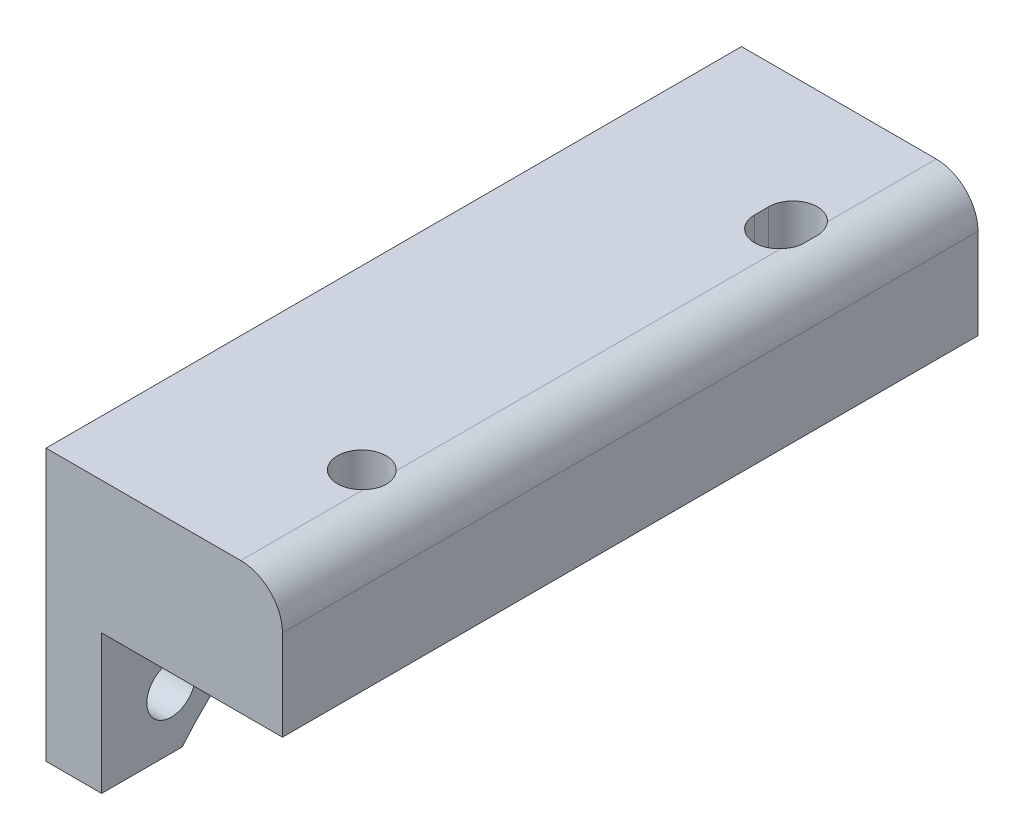
ISO-10303-21;
HEADER;
FILE_DESCRIPTION(('STEP AP214'),'2;1');
FILE_NAME('part.step','',(''),(''),'','','');
FILE_SCHEMA(('AUTOMOTIVE_DESIGN { 1 0 10303 214 1 1 1 1 }'));
ENDSEC;
DATA;
#1=APPLICATION_CONTEXT('core data for automotive mechanical design processes');
#2=APPLICATION_PROTOCOL_DEFINITION('international standard','automotive_design',2000,#1);
#3=PRODUCT_CONTEXT('',#1,'mechanical');
#4=PRODUCT('Part','Part','',(#3));
#5=PRODUCT_RELATED_PRODUCT_CATEGORY('part','',(#4));
#6=PRODUCT_DEFINITION_FORMATION('','',#4);
#7=PRODUCT_DEFINITION_CONTEXT('part definition',#1,'design');
#8=PRODUCT_DEFINITION('design','',#6,#7);
#9=PRODUCT_DEFINITION_SHAPE('','',#8);
#10=(LENGTH_UNIT() NAMED_UNIT(*) SI_UNIT(.MILLI.,.METRE.));
#11=(NAMED_UNIT(*) PLANE_ANGLE_UNIT() SI_UNIT($,.RADIAN.));
#12=(NAMED_UNIT(*) SI_UNIT($,.STERADIAN.) SOLID_ANGLE_UNIT());
#13=UNCERTAINTY_MEASURE_WITH_UNIT(LENGTH_MEASURE(1.E-05),#10,'distance_accuracy_value','');
#14=(GEOMETRIC_REPRESENTATION_CONTEXT(3) GLOBAL_UNCERTAINTY_ASSIGNED_CONTEXT((#13)) GLOBAL_UNIT_ASSIGNED_CONTEXT((#10,
#11,#12)) REPRESENTATION_CONTEXT('',''));
#15=CARTESIAN_POINT('',(0.,0.,0.));
#16=DIRECTION('',(0.,0.,1.));
#17=DIRECTION('',(1.,0.,0.));
#18=AXIS2_PLACEMENT_3D('',#15,#16,#17);
#19=CARTESIAN_POINT('',(8.7,-490.5,10.));
#20=DIRECTION('',(0.,1.,0.));
#21=DIRECTION('',(0.,0.,1.));
#22=AXIS2_PLACEMENT_3D('',#19,#20,#21);
#23=CYLINDRICAL_SURFACE('',#22,1.75);
#24=CARTESIAN_POINT('',(8.7,5.,10.));
#25=DIRECTION('',(0.,-1.,0.));
#26=DIRECTION('',(0.,0.,-1.));
#27=AXIS2_PLACEMENT_3D('',#24,#25,#26);
#28=CIRCLE('',#27,1.75);
#29=CARTESIAN_POINT('',(6.95,5.,10.));
#30=VERTEX_POINT('',#29);
#31=CARTESIAN_POINT('',(10.45,5.,10.));
#32=VERTEX_POINT('',#31);
#33=EDGE_CURVE('E98',#30,#32,#28,.F.);
#34=ORIENTED_EDGE('',*,*,#33,.F.);
#35=DIRECTION('',(0.,1.,0.));
#36=VECTOR('',#35,1.);
#37=CARTESIAN_POINT('',(6.95,-490.5,10.));
#38=LINE('',#37,#36);
#39=CARTESIAN_POINT('',(6.95,9.5,10.));
#40=VERTEX_POINT('',#39);
#41=EDGE_CURVE('E427',#30,#40,#38,.T.);
#42=ORIENTED_EDGE('',*,*,#41,.T.);
#43=CARTESIAN_POINT('',(8.7,9.5,10.));
#44=DIRECTION('',(0.,1.,0.));
#45=DIRECTION('',(0.,0.,1.));
#46=AXIS2_PLACEMENT_3D('',#43,#44,#45);
#47=CIRCLE('',#46,1.75);
#48=CARTESIAN_POINT('',(10.,9.5,11.171537451386));
#49=VERTEX_POINT('',#48);
#50=EDGE_CURVE('E414',#40,#49,#47,.T.);
#51=ORIENTED_EDGE('',*,*,#50,.T.);
#52=CARTESIAN_POINT('',(10.,9.5,11.171537451386));
#53=CARTESIAN_POINT('',(10.0328407033117,9.49999890240579,11.1350951876019));
#54=CARTESIAN_POINT('',(10.0641287056052,9.49946104075351,11.0972936026077));
#55=CARTESIAN_POINT('',(10.1234117102489,9.49760729265127,11.0192173067007));
#56=CARTESIAN_POINT('',(10.1514072309634,9.4962915288704,10.9789429866161));
#57=CARTESIAN_POINT('',(10.2302265782897,9.49161792356044,10.8547012877514));
#58=CARTESIAN_POINT('',(10.2758351726297,9.48753462325957,10.7673685539722));
#59=CARTESIAN_POINT('',(10.3517767145912,9.47955037059692,10.5863380306489));
#60=CARTESIAN_POINT('',(10.3821056696932,9.47564946613589,10.4926385847547));
#61=CARTESIAN_POINT('',(10.4265885367107,9.46960188462455,10.3015931382367));
#62=CARTESIAN_POINT('',(10.4407879247889,9.4674502804472,10.2042581930972));
#63=CARTESIAN_POINT('',(10.4478356949534,9.4663851704101,10.0888212707608));
#64=CARTESIAN_POINT('',(10.448647501167,9.46626267224952,10.07105913752));
#65=CARTESIAN_POINT('',(10.4497289938887,9.46609939302913,10.0355330828585));
#66=CARTESIAN_POINT('',(10.4499991401859,9.46605854266254,10.0177691757658));
#67=CARTESIAN_POINT('',(10.45,9.46605798999279,10.));
#68=B_SPLINE_CURVE_WITH_KNOTS('',3,(#52,#53,#54,#55,#56,#57,#58,#59,#60,#61,#62,#63,#64,#65,#66,
#67),.UNSPECIFIED.,.F.,.F.,(4,2,2,2,2,2,2,4),(0.,0.147067831392479,0.294112477517909,
0.588414421108055,0.882793224996483,1.17633997263697,1.22968015531883,1.28297504088834),.UNSPECIFIED.);
#69=CARTESIAN_POINT('',(10.45,9.46605798999278,10.));
#70=VERTEX_POINT('',#69);
#71=EDGE_CURVE('E470',#49,#70,#68,.T.);
#72=ORIENTED_EDGE('',*,*,#71,.T.);
#73=DIRECTION('',(0.,1.,0.));
#74=VECTOR('',#73,1.);
#75=CARTESIAN_POINT('',(10.45,-490.5,10.));
#76=LINE('',#75,#74);
#77=EDGE_CURVE('E426',#32,#70,#76,.T.);
#78=ORIENTED_EDGE('',*,*,#77,.F.);
#79=EDGE_LOOP('',(#34,#42,#51,#72,#78));
#80=FACE_BOUND('',#79,.T.);
#81=ADVANCED_FACE('F74',(#80),#23,.F.);
#82=CARTESIAN_POINT('',(6.95,-490.5,10.));
#83=DIRECTION('',(-1.,0.,0.));
#84=DIRECTION('',(0.,0.,1.));
#85=AXIS2_PLACEMENT_3D('',#82,#83,#84);
#86=PLANE('',#85);
#87=DIRECTION('',(0.,0.,1.));
#88=VECTOR('',#87,1.);
#89=CARTESIAN_POINT('',(6.95,5.,0.));
#90=LINE('',#89,#88);
#91=CARTESIAN_POINT('',(6.95,5.,9.));
#92=VERTEX_POINT('',#91);
#93=EDGE_CURVE('E290',#92,#30,#90,.T.);
#94=ORIENTED_EDGE('',*,*,#93,.F.);
#95=DIRECTION('',(0.,1.,0.));
#96=VECTOR('',#95,1.);
#97=CARTESIAN_POINT('',(6.95,-490.5,9.));
#98=LINE('',#97,#96);
#99=CARTESIAN_POINT('',(6.95,9.5,9.));
#100=VERTEX_POINT('',#99);
#101=EDGE_CURVE('E430',#92,#100,#98,.T.);
#102=ORIENTED_EDGE('',*,*,#101,.T.);
#103=DIRECTION('',(0.,0.,1.));
#104=VECTOR('',#103,1.);
#105=CARTESIAN_POINT('',(6.95,9.5,10.));
#106=LINE('',#105,#104);
#107=EDGE_CURVE('E423',#100,#40,#106,.T.);
#108=ORIENTED_EDGE('',*,*,#107,.T.);
#109=ORIENTED_EDGE('',*,*,#41,.F.);
#110=EDGE_LOOP('',(#94,#102,#108,#109));
#111=FACE_BOUND('',#110,.T.);
#112=ADVANCED_FACE('F512',(#111),#86,.F.);
#113=CARTESIAN_POINT('',(8.7,-490.5,9.));
#114=DIRECTION('',(0.,1.,0.));
#115=DIRECTION('',(0.,0.,1.));
#116=AXIS2_PLACEMENT_3D('',#113,#114,#115);
#117=CYLINDRICAL_SURFACE('',#116,1.75);
#118=CARTESIAN_POINT('',(8.7,5.,9.));
#119=DIRECTION('',(0.,-1.,0.));
#120=DIRECTION('',(0.,0.,-1.));
#121=AXIS2_PLACEMENT_3D('',#118,#119,#120);
#122=CIRCLE('',#121,1.75);
#123=CARTESIAN_POINT('',(10.45,5.,9.));
#124=VERTEX_POINT('',#123);
#125=EDGE_CURVE('E288',#124,#92,#122,.F.);
#126=ORIENTED_EDGE('',*,*,#125,.F.);
#127=DIRECTION('',(0.,1.,0.));
#128=VECTOR('',#127,1.);
#129=CARTESIAN_POINT('',(10.45,-490.5,9.));
#130=LINE('',#129,#128);
#131=CARTESIAN_POINT('',(10.45,9.46605798999278,9.));
#132=VERTEX_POINT('',#131);
#133=EDGE_CURVE('E432',#124,#132,#130,.T.);
#134=ORIENTED_EDGE('',*,*,#133,.T.);
#135=CARTESIAN_POINT('',(10.45,9.46605798999278,9.));
#136=CARTESIAN_POINT('',(10.4500051266865,9.46604807112008,8.95094832923282));
#137=CARTESIAN_POINT('',(10.4479377551647,9.46637064782511,8.90189974050053));
#138=CARTESIAN_POINT('',(10.4396974305362,9.46760810034441,8.80416010867635));
#139=CARTESIAN_POINT('',(10.4335248262539,9.46852292583472,8.75546903556149));
#140=CARTESIAN_POINT('',(10.417101450055,9.47087392302102,8.65871673816483));
#141=CARTESIAN_POINT('',(10.4068447331462,9.47231085444661,8.6106565380176));
#142=CARTESIAN_POINT('',(10.3823379718021,9.47556192998593,8.51559258655544));
#143=CARTESIAN_POINT('',(10.3680880839838,9.47737605930477,8.46858879388503));
#144=CARTESIAN_POINT('',(10.3194784618778,9.48312197295655,8.32962097897762));
#145=CARTESIAN_POINT('',(10.2792509888801,9.48735868442975,8.23965500646275));
#146=CARTESIAN_POINT('',(10.1843590716257,9.4947033225791,8.06792261328006));
#147=CARTESIAN_POINT('',(10.129736210239,9.49781444022062,7.98613349659695));
#148=CARTESIAN_POINT('',(10.0576966146507,9.49946546016106,7.89570098805505));
#149=CARTESIAN_POINT('',(10.0464389487409,9.49966245169849,7.88200288921193));
#150=CARTESIAN_POINT('',(10.0235214200421,9.49992966343973,7.85496559728524));
#151=CARTESIAN_POINT('',(10.0118618978557,9.49999998843477,7.84162611652624));
#152=CARTESIAN_POINT('',(10.,9.5,7.828462548614));
#153=B_SPLINE_CURVE_WITH_KNOTS('',3,(#135,#136,#137,#138,#139,#140,#141,#142,#143,#144,#145,
#146,#147,#148,#149,#150,#151,#152),.UNSPECIFIED.,.F.,.F.,(4,2,2,2,2,2,2,2,4),(0.,
0.147105082033193,0.294197666042904,0.441505151042381,0.588806859273429,0.883273465680642,
1.17689861860279,1.23008971409581,1.28323678434279),.UNSPECIFIED.);
#154=CARTESIAN_POINT('',(10.,9.5,7.828462548614));
#155=VERTEX_POINT('',#154);
#156=EDGE_CURVE('E538',#132,#155,#153,.T.);
#157=ORIENTED_EDGE('',*,*,#156,.T.);
#158=CARTESIAN_POINT('',(8.7,9.5,9.));
#159=DIRECTION('',(0.,1.,0.));
#160=DIRECTION('',(0.,0.,1.));
#161=AXIS2_PLACEMENT_3D('',#158,#159,#160);
#162=CIRCLE('',#161,1.75);
#163=EDGE_CURVE('E420',#155,#100,#162,.T.);
#164=ORIENTED_EDGE('',*,*,#163,.T.);
#165=ORIENTED_EDGE('',*,*,#101,.F.);
#166=EDGE_LOOP('',(#126,#134,#157,#164,#165));
#167=FACE_BOUND('',#166,.T.);
#168=ADVANCED_FACE('F517',(#167),#117,.F.);
#169=CARTESIAN_POINT('',(10.45,-490.5,10.));
#170=DIRECTION('',(1.,0.,0.));
#171=DIRECTION('',(0.,0.,-1.));
#172=AXIS2_PLACEMENT_3D('',#169,#170,#171);
#173=PLANE('',#172);
#174=DIRECTION('',(0.,0.,-1.));
#175=VECTOR('',#174,1.);
#176=CARTESIAN_POINT('',(10.45,5.,0.));
#177=LINE('',#176,#175);
#178=EDGE_CURVE('E261',#32,#124,#177,.T.);
#179=ORIENTED_EDGE('',*,*,#178,.F.);
#180=ORIENTED_EDGE('',*,*,#77,.T.);
#181=DIRECTION('',(0.,0.,-1.));
#182=VECTOR('',#181,1.);
#183=CARTESIAN_POINT('',(10.45,9.46605798999278,10.));
#184=LINE('',#183,#182);
#185=EDGE_CURVE('E537',#70,#132,#184,.T.);
#186=ORIENTED_EDGE('',*,*,#185,.T.);
#187=ORIENTED_EDGE('',*,*,#133,.F.);
#188=EDGE_LOOP('',(#179,#180,#186,#187));
#189=FACE_BOUND('',#188,.T.);
#190=ADVANCED_FACE('F481',(#189),#173,.F.);
#191=CARTESIAN_POINT('',(8.7,-490.5,40.));
#192=DIRECTION('',(0.,1.,0.));
#193=DIRECTION('',(0.,0.,1.));
#194=AXIS2_PLACEMENT_3D('',#191,#192,#193);
#195=CYLINDRICAL_SURFACE('',#194,1.75);
#196=CARTESIAN_POINT('',(8.7,9.5,40.));
#197=DIRECTION('',(0.,1.,0.));
#198=DIRECTION('',(0.,0.,1.));
#199=AXIS2_PLACEMENT_3D('',#196,#197,#198);
#200=CIRCLE('',#199,1.75);
#201=CARTESIAN_POINT('',(10.,9.5,38.828462548614));
#202=VERTEX_POINT('',#201);
#203=CARTESIAN_POINT('',(10.,9.5,41.171537451386));
#204=VERTEX_POINT('',#203);
#205=EDGE_CURVE('E429',#202,#204,#200,.T.);
#206=ORIENTED_EDGE('',*,*,#205,.T.);
#207=CARTESIAN_POINT('',(10.,9.5,41.171537451386));
#208=CARTESIAN_POINT('',(10.0328749516423,9.49999887144313,41.1350578580053));
#209=CARTESIAN_POINT('',(10.0641939874611,9.49945990283889,41.0972150561432));
#210=CARTESIAN_POINT('',(10.1235305643835,9.49760266939232,41.0190533158655));
#211=CARTESIAN_POINT('',(10.1515487816629,9.49628456449088,40.9787348871678));
#212=CARTESIAN_POINT('',(10.2303195410964,9.49160952908746,40.8545246880151));
#213=CARTESIAN_POINT('',(10.2758736956202,9.487530349473,40.7672829026211));
#214=CARTESIAN_POINT('',(10.3517320560677,9.47955528947623,40.5864383073544));
#215=CARTESIAN_POINT('',(10.3820347417946,9.47565942740125,40.4928348644359));
#216=CARTESIAN_POINT('',(10.4265541700122,9.46960624931772,40.3018484939655));
#217=CARTESIAN_POINT('',(10.4407785274777,9.46744811043279,40.2044673782082));
#218=CARTESIAN_POINT('',(10.452722134172,9.46565028458005,40.0087300122083));
#219=CARTESIAN_POINT('',(10.4504504481947,9.46600921444598,39.9103743271756));
#220=CARTESIAN_POINT('',(10.4294865205998,9.46911596757569,39.7154082310398));
#221=CARTESIAN_POINT('',(10.4107845374121,9.47186520805144,39.6187988900355));
#222=CARTESIAN_POINT('',(10.3576451496693,9.47872433291843,39.4305794373202));
#223=CARTESIAN_POINT('',(10.3232821135311,9.48282776165628,39.3389479636378));
#224=CARTESIAN_POINT('',(10.2398018336376,9.49069184666999,39.1627529950531));
#225=CARTESIAN_POINT('',(10.1907075982373,9.49445302564559,39.0781787390116));
#226=CARTESIAN_POINT('',(10.1142520052832,9.49789502824066,38.9686372124601));
#227=CARTESIAN_POINT('',(10.0926068747592,9.49865492600836,38.9395943996003));
#228=CARTESIAN_POINT('',(10.0475871311056,9.49970698792501,38.8829445049579));
#229=CARTESIAN_POINT('',(10.0242151737552,9.49999985529846,38.8553353252668));
#230=CARTESIAN_POINT('',(10.,9.5,38.828462548614));
#231=B_SPLINE_CURVE_WITH_KNOTS('',3,(#207,#208,#209,#210,#211,#212,#213,#214,#215,#216,#217,
#218,#219,#220,#221,#222,#223,#224,#225,#226,#227,#228,#229,#230),.UNSPECIFIED.,.F.,.F.,(4,2,2,
2,2,2,2,2,2,2,2,4),(0.,0.147221146348865,0.294412081668459,0.588415212558505,0.882447642537411,
1.17634075523566,1.470072382011,1.76397828072825,2.05650284370972,2.34857287602916,
2.45720469123512,2.56567278062651),.UNSPECIFIED.);
#232=EDGE_CURVE('E464',#204,#202,#231,.T.);
#233=ORIENTED_EDGE('',*,*,#232,.T.);
#234=EDGE_LOOP('',(#206,#233));
#235=FACE_BOUND('',#234,.T.);
#236=CARTESIAN_POINT('',(8.7,5.,40.));
#237=DIRECTION('',(0.,-1.,0.));
#238=DIRECTION('',(0.,0.,-1.));
#239=AXIS2_PLACEMENT_3D('',#236,#237,#238);
#240=CIRCLE('',#239,1.75);
#241=CARTESIAN_POINT('',(8.7,5.,38.25));
#242=VERTEX_POINT('',#241);
#243=EDGE_CURVE('E315',#242,#242,#240,.F.);
#244=ORIENTED_EDGE('',*,*,#243,.F.);
#245=EDGE_LOOP('',(#244));
#246=FACE_BOUND('',#245,.T.);
#247=ADVANCED_FACE('F476',(#235,#246),#195,.F.);
#248=CARTESIAN_POINT('',(0.,0.,50.));
#249=DIRECTION('',(0.,0.,-1.));
#250=DIRECTION('',(-1.,0.,0.));
#251=AXIS2_PLACEMENT_3D('',#248,#249,#250);
#252=PLANE('',#251);
#253=DIRECTION('',(0.,1.,0.));
#254=VECTOR('',#253,1.);
#255=CARTESIAN_POINT('',(13.,0.,50.));
#256=LINE('',#255,#254);
#257=CARTESIAN_POINT('',(13.,0.,50.));
#258=VERTEX_POINT('',#257);
#259=CARTESIAN_POINT('',(13.,6.5,50.));
#260=VERTEX_POINT('',#259);
#261=EDGE_CURVE('E440',#258,#260,#256,.T.);
#262=ORIENTED_EDGE('',*,*,#261,.T.);
#263=CARTESIAN_POINT('',(10.,6.5,50.));
#264=DIRECTION('',(0.,0.,-1.));
#265=DIRECTION('',(-1.,0.,0.));
#266=AXIS2_PLACEMENT_3D('',#263,#264,#265);
#267=CIRCLE('',#266,3.);
#268=CARTESIAN_POINT('',(9.99999999999999,9.5,50.));
#269=VERTEX_POINT('',#268);
#270=EDGE_CURVE('E12',#260,#269,#267,.F.);
#271=ORIENTED_EDGE('',*,*,#270,.T.);
#272=DIRECTION('',(-1.,0.,0.));
#273=VECTOR('',#272,1.);
#274=CARTESIAN_POINT('',(0.,9.5,50.));
#275=LINE('',#274,#273);
#276=CARTESIAN_POINT('',(-4.,9.5,50.));
#277=VERTEX_POINT('',#276);
#278=EDGE_CURVE('E444',#269,#277,#275,.T.);
#279=ORIENTED_EDGE('',*,*,#278,.T.);
#280=DIRECTION('',(0.,1.,0.));
#281=VECTOR('',#280,1.);
#282=CARTESIAN_POINT('',(-4.,9.5,50.));
#283=LINE('',#282,#281);
#284=CARTESIAN_POINT('',(-4.,-10.,50.));
#285=VERTEX_POINT('',#284);
#286=EDGE_CURVE('E407',#285,#277,#283,.T.);
#287=ORIENTED_EDGE('',*,*,#286,.F.);
#288=DIRECTION('',(1.,0.,0.));
#289=VECTOR('',#288,1.);
#290=CARTESIAN_POINT('',(-33.5,-10.,50.));
#291=LINE('',#290,#289);
#292=CARTESIAN_POINT('',(0.,-10.,50.));
#293=VERTEX_POINT('',#292);
#294=EDGE_CURVE('E391',#285,#293,#291,.T.);
#295=ORIENTED_EDGE('',*,*,#294,.T.);
#296=DIRECTION('',(0.,1.,0.));
#297=VECTOR('',#296,1.);
#298=CARTESIAN_POINT('',(0.,9.5,50.));
#299=LINE('',#298,#297);
#300=CARTESIAN_POINT('',(0.,0.,50.));
#301=VERTEX_POINT('',#300);
#302=EDGE_CURVE('E408',#293,#301,#299,.T.);
#303=ORIENTED_EDGE('',*,*,#302,.T.);
#304=DIRECTION('',(1.,0.,0.));
#305=VECTOR('',#304,1.);
#306=CARTESIAN_POINT('',(0.,0.,50.));
#307=LINE('',#306,#305);
#308=EDGE_CURVE('E438',#301,#258,#307,.T.);
#309=ORIENTED_EDGE('',*,*,#308,.T.);
#310=EDGE_LOOP('',(#262,#271,#279,#287,#295,#303,#309));
#311=FACE_BOUND('',#310,.T.);
#312=ADVANCED_FACE('F480',(#311),#252,.F.);
#313=CARTESIAN_POINT('',(0.,0.,0.));
#314=DIRECTION('',(0.,0.,-1.));
#315=DIRECTION('',(-1.,0.,0.));
#316=AXIS2_PLACEMENT_3D('',#313,#314,#315);
#317=PLANE('',#316);
#318=DIRECTION('',(-1.,0.,0.));
#319=VECTOR('',#318,1.);
#320=CARTESIAN_POINT('',(0.,9.5,0.));
#321=LINE('',#320,#319);
#322=CARTESIAN_POINT('',(9.99999999999999,9.5,0.));
#323=VERTEX_POINT('',#322);
#324=CARTESIAN_POINT('',(-4.,9.5,0.));
#325=VERTEX_POINT('',#324);
#326=EDGE_CURVE('E441',#323,#325,#321,.T.);
#327=ORIENTED_EDGE('',*,*,#326,.F.);
#328=CARTESIAN_POINT('',(10.,6.5,0.));
#329=DIRECTION('',(0.,0.,-1.));
#330=DIRECTION('',(-1.,0.,0.));
#331=AXIS2_PLACEMENT_3D('',#328,#329,#330);
#332=CIRCLE('',#331,3.);
#333=CARTESIAN_POINT('',(13.,6.5,0.));
#334=VERTEX_POINT('',#333);
#335=EDGE_CURVE('E541',#323,#334,#332,.T.);
#336=ORIENTED_EDGE('',*,*,#335,.T.);
#337=DIRECTION('',(0.,1.,0.));
#338=VECTOR('',#337,1.);
#339=CARTESIAN_POINT('',(13.,0.,0.));
#340=LINE('',#339,#338);
#341=CARTESIAN_POINT('',(13.,0.,0.));
#342=VERTEX_POINT('',#341);
#343=EDGE_CURVE('E448',#342,#334,#340,.T.);
#344=ORIENTED_EDGE('',*,*,#343,.F.);
#345=DIRECTION('',(1.,0.,0.));
#346=VECTOR('',#345,1.);
#347=CARTESIAN_POINT('',(0.,0.,0.));
#348=LINE('',#347,#346);
#349=CARTESIAN_POINT('',(0.,0.,0.));
#350=VERTEX_POINT('',#349);
#351=EDGE_CURVE('E437',#350,#342,#348,.T.);
#352=ORIENTED_EDGE('',*,*,#351,.F.);
#353=DIRECTION('',(0.,-1.,0.));
#354=VECTOR('',#353,1.);
#355=CARTESIAN_POINT('',(0.,9.5,0.));
#356=LINE('',#355,#354);
#357=CARTESIAN_POINT('',(0.,-9.99999999999999,0.));
#358=VERTEX_POINT('',#357);
#359=EDGE_CURVE('E403',#350,#358,#356,.T.);
#360=ORIENTED_EDGE('',*,*,#359,.T.);
#361=DIRECTION('',(1.,0.,0.));
#362=VECTOR('',#361,1.);
#363=CARTESIAN_POINT('',(-33.5,-9.99999999999999,0.));
#364=LINE('',#363,#362);
#365=CARTESIAN_POINT('',(-4.,-9.99999999999999,0.));
#366=VERTEX_POINT('',#365);
#367=EDGE_CURVE('E389',#366,#358,#364,.T.);
#368=ORIENTED_EDGE('',*,*,#367,.F.);
#369=DIRECTION('',(0.,-1.,0.));
#370=VECTOR('',#369,1.);
#371=CARTESIAN_POINT('',(-4.,9.5,0.));
#372=LINE('',#371,#370);
#373=EDGE_CURVE('E404',#325,#366,#372,.T.);
#374=ORIENTED_EDGE('',*,*,#373,.F.);
#375=EDGE_LOOP('',(#327,#336,#344,#352,#360,#368,#374));
#376=FACE_BOUND('',#375,.T.);
#377=ADVANCED_FACE('F487',(#376),#317,.T.);
#378=CARTESIAN_POINT('',(-4.,0.,0.));
#379=DIRECTION('',(-1.,0.,0.));
#380=DIRECTION('',(0.,0.,1.));
#381=AXIS2_PLACEMENT_3D('',#378,#379,#380);
#382=PLANE('',#381);
#383=CARTESIAN_POINT('',(-4.,-5.99999999999999,45.));
#384=DIRECTION('',(-1.,0.,0.));
#385=DIRECTION('',(0.,0.,1.));
#386=AXIS2_PLACEMENT_3D('',#383,#384,#385);
#387=CIRCLE('',#386,1.75);
#388=CARTESIAN_POINT('',(-4.,-5.99999999999999,46.75));
#389=VERTEX_POINT('',#388);
#390=EDGE_CURVE('E374',#389,#389,#387,.T.);
#391=ORIENTED_EDGE('',*,*,#390,.F.);
#392=EDGE_LOOP('',(#391));
#393=FACE_BOUND('',#392,.T.);
#394=CARTESIAN_POINT('',(-4.,-5.99999999999999,5.));
#395=DIRECTION('',(-1.,0.,0.));
#396=DIRECTION('',(0.,0.,1.));
#397=AXIS2_PLACEMENT_3D('',#394,#395,#396);
#398=CIRCLE('',#397,1.75);
#399=CARTESIAN_POINT('',(-4.,-5.99999999999999,6.75));
#400=VERTEX_POINT('',#399);
#401=EDGE_CURVE('E369',#400,#400,#398,.T.);
#402=ORIENTED_EDGE('',*,*,#401,.F.);
#403=EDGE_LOOP('',(#402));
#404=FACE_BOUND('',#403,.T.);
#405=ORIENTED_EDGE('',*,*,#373,.T.);
#406=DIRECTION('',(0.,0.,1.));
#407=VECTOR('',#406,1.);
#408=CARTESIAN_POINT('',(-4.,-10.,0.));
#409=LINE('',#408,#407);
#410=CARTESIAN_POINT('',(-4.,-9.99999999999999,5.79062728770145));
#411=VERTEX_POINT('',#410);
#412=EDGE_CURVE('E398',#366,#411,#409,.T.);
#413=ORIENTED_EDGE('',*,*,#412,.T.);
#414=CARTESIAN_POINT('',(-4.,-26.,25.));
#415=DIRECTION('',(-1.,0.,0.));
#416=DIRECTION('',(0.,0.,1.));
#417=AXIS2_PLACEMENT_3D('',#414,#415,#416);
#418=CIRCLE('',#417,25.);
#419=CARTESIAN_POINT('',(-4.,-10.,44.2093727122986));
#420=VERTEX_POINT('',#419);
#421=EDGE_CURVE('E401',#420,#411,#418,.T.);
#422=ORIENTED_EDGE('',*,*,#421,.F.);
#423=DIRECTION('',(0.,0.,1.));
#424=VECTOR('',#423,1.);
#425=CARTESIAN_POINT('',(-4.,-10.,0.));
#426=LINE('',#425,#424);
#427=EDGE_CURVE('E388',#420,#285,#426,.T.);
#428=ORIENTED_EDGE('',*,*,#427,.T.);
#429=ORIENTED_EDGE('',*,*,#286,.T.);
#430=DIRECTION('',(0.,0.,-1.));
#431=VECTOR('',#430,1.);
#432=CARTESIAN_POINT('',(-4.,9.5,0.));
#433=LINE('',#432,#431);
#434=EDGE_CURVE('E411',#277,#325,#433,.T.);
#435=ORIENTED_EDGE('',*,*,#434,.T.);
#436=EDGE_LOOP('',(#405,#413,#422,#428,#429,#435));
#437=FACE_BOUND('',#436,.T.);
#438=ADVANCED_FACE('F491',(#393,#404,#437),#382,.T.);
#439=CARTESIAN_POINT('',(0.,0.,0.));
#440=DIRECTION('',(-1.,0.,0.));
#441=DIRECTION('',(0.,0.,1.));
#442=AXIS2_PLACEMENT_3D('',#439,#440,#441);
#443=PLANE('',#442);
#444=CARTESIAN_POINT('',(0.,-5.99999999999999,45.));
#445=DIRECTION('',(1.,0.,0.));
#446=DIRECTION('',(0.,0.,-1.));
#447=AXIS2_PLACEMENT_3D('',#444,#445,#446);
#448=CIRCLE('',#447,1.75);
#449=CARTESIAN_POINT('',(0.,-5.99999999999999,43.25));
#450=VERTEX_POINT('',#449);
#451=EDGE_CURVE('E366',#450,#450,#448,.T.);
#452=ORIENTED_EDGE('',*,*,#451,.F.);
#453=EDGE_LOOP('',(#452));
#454=FACE_BOUND('',#453,.T.);
#455=CARTESIAN_POINT('',(0.,-5.99999999999999,5.));
#456=DIRECTION('',(1.,0.,0.));
#457=DIRECTION('',(0.,0.,-1.));
#458=AXIS2_PLACEMENT_3D('',#455,#456,#457);
#459=CIRCLE('',#458,1.75);
#460=CARTESIAN_POINT('',(0.,-5.99999999999999,3.25));
#461=VERTEX_POINT('',#460);
#462=EDGE_CURVE('E355',#461,#461,#459,.T.);
#463=ORIENTED_EDGE('',*,*,#462,.F.);
#464=EDGE_LOOP('',(#463));
#465=FACE_BOUND('',#464,.T.);
#466=DIRECTION('',(0.,0.,-1.));
#467=VECTOR('',#466,1.);
#468=CARTESIAN_POINT('',(0.,-10.,0.));
#469=LINE('',#468,#467);
#470=CARTESIAN_POINT('',(0.,-9.99999999999999,5.79062728770145));
#471=VERTEX_POINT('',#470);
#472=EDGE_CURVE('E382',#471,#358,#469,.T.);
#473=ORIENTED_EDGE('',*,*,#472,.T.);
#474=ORIENTED_EDGE('',*,*,#359,.F.);
#475=DIRECTION('',(0.,0.,-1.));
#476=VECTOR('',#475,1.);
#477=CARTESIAN_POINT('',(0.,0.,50.));
#478=LINE('',#477,#476);
#479=EDGE_CURVE('E454',#301,#350,#478,.T.);
#480=ORIENTED_EDGE('',*,*,#479,.F.);
#481=ORIENTED_EDGE('',*,*,#302,.F.);
#482=DIRECTION('',(0.,0.,-1.));
#483=VECTOR('',#482,1.);
#484=CARTESIAN_POINT('',(0.,-10.,0.));
#485=LINE('',#484,#483);
#486=CARTESIAN_POINT('',(0.,-10.,44.2093727122986));
#487=VERTEX_POINT('',#486);
#488=EDGE_CURVE('E379',#293,#487,#485,.T.);
#489=ORIENTED_EDGE('',*,*,#488,.T.);
#490=CARTESIAN_POINT('',(0.,-26.,25.));
#491=DIRECTION('',(1.,0.,0.));
#492=DIRECTION('',(0.,0.,-1.));
#493=AXIS2_PLACEMENT_3D('',#490,#491,#492);
#494=CIRCLE('',#493,25.);
#495=EDGE_CURVE('E377',#471,#487,#494,.T.);
#496=ORIENTED_EDGE('',*,*,#495,.F.);
#497=EDGE_LOOP('',(#473,#474,#480,#481,#489,#496));
#498=FACE_BOUND('',#497,.T.);
#499=ADVANCED_FACE('F503',(#454,#465,#498),#443,.F.);
#500=CARTESIAN_POINT('',(0.,0.,50.));
#501=DIRECTION('',(0.,1.,0.));
#502=DIRECTION('',(0.,0.,1.));
#503=AXIS2_PLACEMENT_3D('',#500,#501,#502);
#504=PLANE('',#503);
#505=DIRECTION('',(-0.866025403784439,0.,0.5));
#506=VECTOR('',#505,1.);
#507=CARTESIAN_POINT('',(7.95512701892219,0.,13.7786841774372));
#508=LINE('',#507,#506);
#509=CARTESIAN_POINT('',(11.6,0.,11.6743157806499));
#510=VERTEX_POINT('',#509);
#511=CARTESIAN_POINT('',(8.7,0.,13.3486315612998));
#512=VERTEX_POINT('',#511);
#513=EDGE_CURVE('E295',#510,#512,#508,.T.);
#514=ORIENTED_EDGE('',*,*,#513,.F.);
#515=DIRECTION('',(0.,0.,1.));
#516=VECTOR('',#515,1.);
#517=CARTESIAN_POINT('',(11.6,0.,0.));
#518=LINE('',#517,#516);
#519=CARTESIAN_POINT('',(11.6,0.,7.32568421935008));
#520=VERTEX_POINT('',#519);
#521=EDGE_CURVE('E90',#520,#510,#518,.T.);
#522=ORIENTED_EDGE('',*,*,#521,.F.);
#523=DIRECTION('',(0.866025403784439,0.,0.5));
#524=VECTOR('',#523,1.);
#525=CARTESIAN_POINT('',(-0.272114317029976,0.,0.471315822562824));
#526=LINE('',#525,#524);
#527=CARTESIAN_POINT('',(8.7,0.,5.65136843870017));
#528=VERTEX_POINT('',#527);
#529=EDGE_CURVE('E275',#528,#520,#526,.T.);
#530=ORIENTED_EDGE('',*,*,#529,.F.);
#531=DIRECTION('',(0.866025403784439,0.,-0.5));
#532=VECTOR('',#531,1.);
#533=CARTESIAN_POINT('',(4.62211431702997,0.,8.00573683548744));
#534=LINE('',#533,#532);
#535=CARTESIAN_POINT('',(5.8,0.,7.32568421935009));
#536=VERTEX_POINT('',#535);
#537=EDGE_CURVE('E278',#536,#528,#534,.T.);
#538=ORIENTED_EDGE('',*,*,#537,.F.);
#539=DIRECTION('',(0.,0.,-1.));
#540=VECTOR('',#539,1.);
#541=CARTESIAN_POINT('',(5.8,0.,0.));
#542=LINE('',#541,#540);
#543=CARTESIAN_POINT('',(5.8,0.,11.6743157806499));
#544=VERTEX_POINT('',#543);
#545=EDGE_CURVE('E300',#544,#536,#542,.T.);
#546=ORIENTED_EDGE('',*,*,#545,.F.);
#547=DIRECTION('',(-0.866025403784439,0.,-0.5));
#548=VECTOR('',#547,1.);
#549=CARTESIAN_POINT('',(-3.60512701892219,0.,6.24426316451257));
#550=LINE('',#549,#548);
#551=EDGE_CURVE('E297',#512,#544,#550,.T.);
#552=ORIENTED_EDGE('',*,*,#551,.F.);
#553=EDGE_LOOP('',(#514,#522,#530,#538,#546,#552));
#554=FACE_BOUND('',#553,.T.);
#555=DIRECTION('',(0.866025403784439,0.,0.5));
#556=VECTOR('',#555,1.);
#557=CARTESIAN_POINT('',(-13.6955080756888,0.,23.7213158225628));
#558=LINE('',#557,#556);
#559=CARTESIAN_POINT('',(8.7,0.,36.6513684387002));
#560=VERTEX_POINT('',#559);
#561=CARTESIAN_POINT('',(11.6,0.,38.3256842193501));
#562=VERTEX_POINT('',#561);
#563=EDGE_CURVE('E339',#560,#562,#558,.T.);
#564=ORIENTED_EDGE('',*,*,#563,.F.);
#565=DIRECTION('',(0.866025403784439,0.,-0.499999999999999));
#566=VECTOR('',#565,1.);
#567=CARTESIAN_POINT('',(18.0455080756888,0.,31.2557368354875));
#568=LINE('',#567,#566);
#569=CARTESIAN_POINT('',(5.8,0.,38.3256842193501));
#570=VERTEX_POINT('',#569);
#571=EDGE_CURVE('E307',#570,#560,#568,.T.);
#572=ORIENTED_EDGE('',*,*,#571,.F.);
#573=DIRECTION('',(0.,0.,-1.));
#574=VECTOR('',#573,1.);
#575=CARTESIAN_POINT('',(5.8,0.,0.));
#576=LINE('',#575,#574);
#577=CARTESIAN_POINT('',(5.8,0.,41.6743157806499));
#578=VERTEX_POINT('',#577);
#579=EDGE_CURVE('E319',#578,#570,#576,.T.);
#580=ORIENTED_EDGE('',*,*,#579,.F.);
#581=DIRECTION('',(-0.866025403784439,0.,-0.5));
#582=VECTOR('',#581,1.);
#583=CARTESIAN_POINT('',(-16.5955080756888,0.,28.7442631645126));
#584=LINE('',#583,#582);
#585=CARTESIAN_POINT('',(8.69999999999999,0.,43.3486315612998));
#586=VERTEX_POINT('',#585);
#587=EDGE_CURVE('E348',#586,#578,#584,.T.);
#588=ORIENTED_EDGE('',*,*,#587,.F.);
#589=DIRECTION('',(-0.866025403784438,0.,0.500000000000001));
#590=VECTOR('',#589,1.);
#591=CARTESIAN_POINT('',(20.9455080756888,0.,36.2786841774372));
#592=LINE('',#591,#590);
#593=CARTESIAN_POINT('',(11.6,0.,41.6743157806499));
#594=VERTEX_POINT('',#593);
#595=EDGE_CURVE('E345',#594,#586,#592,.T.);
#596=ORIENTED_EDGE('',*,*,#595,.F.);
#597=DIRECTION('',(0.,0.,1.));
#598=VECTOR('',#597,1.);
#599=CARTESIAN_POINT('',(11.6,0.,0.));
#600=LINE('',#599,#598);
#601=EDGE_CURVE('E342',#562,#594,#600,.T.);
#602=ORIENTED_EDGE('',*,*,#601,.F.);
#603=EDGE_LOOP('',(#564,#572,#580,#588,#596,#602));
#604=FACE_BOUND('',#603,.T.);
#605=ORIENTED_EDGE('',*,*,#351,.T.);
#606=DIRECTION('',(0.,0.,-1.));
#607=VECTOR('',#606,1.);
#608=CARTESIAN_POINT('',(13.,0.,50.));
#609=LINE('',#608,#607);
#610=EDGE_CURVE('E446',#258,#342,#609,.T.);
#611=ORIENTED_EDGE('',*,*,#610,.F.);
#612=ORIENTED_EDGE('',*,*,#308,.F.);
#613=ORIENTED_EDGE('',*,*,#479,.T.);
#614=EDGE_LOOP('',(#605,#611,#612,#613));
#615=FACE_BOUND('',#614,.T.);
#616=ADVANCED_FACE('F500',(#554,#604,#615),#504,.F.);
#617=CARTESIAN_POINT('',(13.,0.,50.));
#618=DIRECTION('',(-1.,0.,0.));
#619=DIRECTION('',(0.,0.,1.));
#620=AXIS2_PLACEMENT_3D('',#617,#618,#619);
#621=PLANE('',#620);
#622=ORIENTED_EDGE('',*,*,#343,.T.);
#623=DIRECTION('',(0.,0.,-1.));
#624=VECTOR('',#623,1.);
#625=CARTESIAN_POINT('',(13.,6.5,50.));
#626=LINE('',#625,#624);
#627=EDGE_CURVE('E83',#334,#260,#626,.F.);
#628=ORIENTED_EDGE('',*,*,#627,.T.);
#629=ORIENTED_EDGE('',*,*,#261,.F.);
#630=ORIENTED_EDGE('',*,*,#610,.T.);
#631=EDGE_LOOP('',(#622,#628,#629,#630));
#632=FACE_BOUND('',#631,.T.);
#633=ADVANCED_FACE('F497',(#632),#621,.F.);
#634=CARTESIAN_POINT('',(0.,9.5,50.));
#635=DIRECTION('',(0.,-1.,0.));
#636=DIRECTION('',(0.,0.,-1.));
#637=AXIS2_PLACEMENT_3D('',#634,#635,#636);
#638=PLANE('',#637);
#639=ORIENTED_EDGE('',*,*,#278,.F.);
#640=DIRECTION('',(0.,0.,-1.));
#641=VECTOR('',#640,1.);
#642=CARTESIAN_POINT('',(10.,9.5,50.));
#643=LINE('',#642,#641);
#644=EDGE_CURVE('E461',#269,#204,#643,.T.);
#645=ORIENTED_EDGE('',*,*,#644,.T.);
#646=ORIENTED_EDGE('',*,*,#205,.F.);
#647=DIRECTION('',(0.,0.,-1.));
#648=VECTOR('',#647,1.);
#649=CARTESIAN_POINT('',(10.,9.5,50.));
#650=LINE('',#649,#648);
#651=EDGE_CURVE('E459',#202,#49,#650,.T.);
#652=ORIENTED_EDGE('',*,*,#651,.T.);
#653=ORIENTED_EDGE('',*,*,#50,.F.);
#654=ORIENTED_EDGE('',*,*,#107,.F.);
#655=ORIENTED_EDGE('',*,*,#163,.F.);
#656=DIRECTION('',(0.,0.,-1.));
#657=VECTOR('',#656,1.);
#658=CARTESIAN_POINT('',(10.,9.5,50.));
#659=LINE('',#658,#657);
#660=EDGE_CURVE('E457',#155,#323,#659,.T.);
#661=ORIENTED_EDGE('',*,*,#660,.T.);
#662=ORIENTED_EDGE('',*,*,#326,.T.);
#663=ORIENTED_EDGE('',*,*,#434,.F.);
#664=EDGE_LOOP('',(#639,#645,#646,#652,#653,#654,#655,#661,#662,#663));
#665=FACE_BOUND('',#664,.T.);
#666=ADVANCED_FACE('F493',(#665),#638,.F.);
#667=CARTESIAN_POINT('',(-33.5,-26.,25.));
#668=DIRECTION('',(1.,0.,0.));
#669=DIRECTION('',(0.,0.,-1.));
#670=AXIS2_PLACEMENT_3D('',#667,#668,#669);
#671=CYLINDRICAL_SURFACE('',#670,25.);
#672=ORIENTED_EDGE('',*,*,#421,.T.);
#673=DIRECTION('',(1.,0.,0.));
#674=VECTOR('',#673,1.);
#675=CARTESIAN_POINT('',(-33.5,-9.99999999999999,5.79062728770145));
#676=LINE('',#675,#674);
#677=EDGE_CURVE('E386',#411,#471,#676,.T.);
#678=ORIENTED_EDGE('',*,*,#677,.T.);
#679=ORIENTED_EDGE('',*,*,#495,.T.);
#680=DIRECTION('',(1.,0.,0.));
#681=VECTOR('',#680,1.);
#682=CARTESIAN_POINT('',(-33.5,-10.,44.2093727122986));
#683=LINE('',#682,#681);
#684=EDGE_CURVE('E385',#420,#487,#683,.T.);
#685=ORIENTED_EDGE('',*,*,#684,.F.);
#686=EDGE_LOOP('',(#672,#678,#679,#685));
#687=FACE_BOUND('',#686,.T.);
#688=ADVANCED_FACE('F496',(#687),#671,.F.);
#689=CARTESIAN_POINT('',(-33.5,-10.,0.));
#690=DIRECTION('',(0.,-1.,0.));
#691=DIRECTION('',(0.,0.,-1.));
#692=AXIS2_PLACEMENT_3D('',#689,#690,#691);
#693=PLANE('',#692);
#694=ORIENTED_EDGE('',*,*,#367,.T.);
#695=ORIENTED_EDGE('',*,*,#472,.F.);
#696=ORIENTED_EDGE('',*,*,#677,.F.);
#697=ORIENTED_EDGE('',*,*,#412,.F.);
#698=EDGE_LOOP('',(#694,#695,#696,#697));
#699=FACE_BOUND('',#698,.T.);
#700=ADVANCED_FACE('F610',(#699),#693,.T.);
#701=CARTESIAN_POINT('',(-33.5,-10.,0.));
#702=DIRECTION('',(0.,-1.,0.));
#703=DIRECTION('',(0.,0.,-1.));
#704=AXIS2_PLACEMENT_3D('',#701,#702,#703);
#705=PLANE('',#704);
#706=ORIENTED_EDGE('',*,*,#684,.T.);
#707=ORIENTED_EDGE('',*,*,#488,.F.);
#708=ORIENTED_EDGE('',*,*,#294,.F.);
#709=ORIENTED_EDGE('',*,*,#427,.F.);
#710=EDGE_LOOP('',(#706,#707,#708,#709));
#711=FACE_BOUND('',#710,.T.);
#712=ADVANCED_FACE('F614',(#711),#705,.T.);
#713=CARTESIAN_POINT('',(-33.5,-5.99999999999999,5.));
#714=DIRECTION('',(1.,0.,0.));
#715=DIRECTION('',(0.,0.,-1.));
#716=AXIS2_PLACEMENT_3D('',#713,#714,#715);
#717=CYLINDRICAL_SURFACE('',#716,1.75);
#718=ORIENTED_EDGE('',*,*,#401,.T.);
#719=EDGE_LOOP('',(#718));
#720=FACE_BOUND('',#719,.T.);
#721=ORIENTED_EDGE('',*,*,#462,.T.);
#722=EDGE_LOOP('',(#721));
#723=FACE_BOUND('',#722,.T.);
#724=ADVANCED_FACE('F616',(#720,#723),#717,.F.);
#725=CARTESIAN_POINT('',(-33.5,-5.99999999999999,45.));
#726=DIRECTION('',(1.,0.,0.));
#727=DIRECTION('',(0.,0.,-1.));
#728=AXIS2_PLACEMENT_3D('',#725,#726,#727);
#729=CYLINDRICAL_SURFACE('',#728,1.75);
#730=ORIENTED_EDGE('',*,*,#390,.T.);
#731=EDGE_LOOP('',(#730));
#732=FACE_BOUND('',#731,.T.);
#733=ORIENTED_EDGE('',*,*,#451,.T.);
#734=EDGE_LOOP('',(#733));
#735=FACE_BOUND('',#734,.T.);
#736=ADVANCED_FACE('F622',(#732,#735),#729,.F.);
#737=CARTESIAN_POINT('',(10.,6.5,50.));
#738=DIRECTION('',(0.,0.,-1.));
#739=DIRECTION('',(-1.,0.,0.));
#740=AXIS2_PLACEMENT_3D('',#737,#738,#739);
#741=CYLINDRICAL_SURFACE('',#740,3.);
#742=ORIENTED_EDGE('',*,*,#270,.F.);
#743=ORIENTED_EDGE('',*,*,#627,.F.);
#744=ORIENTED_EDGE('',*,*,#335,.F.);
#745=ORIENTED_EDGE('',*,*,#660,.F.);
#746=ORIENTED_EDGE('',*,*,#156,.F.);
#747=ORIENTED_EDGE('',*,*,#185,.F.);
#748=ORIENTED_EDGE('',*,*,#71,.F.);
#749=ORIENTED_EDGE('',*,*,#651,.F.);
#750=ORIENTED_EDGE('',*,*,#232,.F.);
#751=ORIENTED_EDGE('',*,*,#644,.F.);
#752=EDGE_LOOP('',(#742,#743,#744,#745,#746,#747,#748,#749,#750,#751));
#753=FACE_BOUND('',#752,.T.);
#754=ADVANCED_FACE('F76',(#753),#741,.T.);
#755=CARTESIAN_POINT('',(18.0455080756888,5.,31.2557368354875));
#756=DIRECTION('',(-0.499999999999999,0.,-0.866025403784439));
#757=DIRECTION('',(-0.866025403784439,0.,0.499999999999999));
#758=AXIS2_PLACEMENT_3D('',#755,#756,#757);
#759=PLANE('',#758);
#760=ORIENTED_EDGE('',*,*,#571,.T.);
#761=DIRECTION('',(0.,-1.,0.));
#762=VECTOR('',#761,1.);
#763=CARTESIAN_POINT('',(8.7,5.,36.6513684387002));
#764=LINE('',#763,#762);
#765=CARTESIAN_POINT('',(8.7,5.,36.6513684387002));
#766=VERTEX_POINT('',#765);
#767=EDGE_CURVE('E337',#766,#560,#764,.T.);
#768=ORIENTED_EDGE('',*,*,#767,.F.);
#769=DIRECTION('',(0.866025403784439,0.,-0.499999999999999));
#770=VECTOR('',#769,1.);
#771=CARTESIAN_POINT('',(18.0455080756888,5.,31.2557368354875));
#772=LINE('',#771,#770);
#773=CARTESIAN_POINT('',(5.8,5.,38.3256842193501));
#774=VERTEX_POINT('',#773);
#775=EDGE_CURVE('E318',#774,#766,#772,.T.);
#776=ORIENTED_EDGE('',*,*,#775,.F.);
#777=DIRECTION('',(0.,-1.,0.));
#778=VECTOR('',#777,1.);
#779=CARTESIAN_POINT('',(5.8,5.,38.3256842193501));
#780=LINE('',#779,#778);
#781=EDGE_CURVE('E353',#774,#570,#780,.T.);
#782=ORIENTED_EDGE('',*,*,#781,.T.);
#783=EDGE_LOOP('',(#760,#768,#776,#782));
#784=FACE_BOUND('',#783,.T.);
#785=ADVANCED_FACE('F577',(#784),#759,.F.);
#786=CARTESIAN_POINT('',(5.8,5.,0.));
#787=DIRECTION('',(-1.,0.,0.));
#788=DIRECTION('',(0.,0.,1.));
#789=AXIS2_PLACEMENT_3D('',#786,#787,#788);
#790=PLANE('',#789);
#791=ORIENTED_EDGE('',*,*,#579,.T.);
#792=ORIENTED_EDGE('',*,*,#781,.F.);
#793=DIRECTION('',(0.,0.,-1.));
#794=VECTOR('',#793,1.);
#795=CARTESIAN_POINT('',(5.8,5.,0.));
#796=LINE('',#795,#794);
#797=CARTESIAN_POINT('',(5.8,5.,41.6743157806499));
#798=VERTEX_POINT('',#797);
#799=EDGE_CURVE('E334',#798,#774,#796,.T.);
#800=ORIENTED_EDGE('',*,*,#799,.F.);
#801=DIRECTION('',(0.,-1.,0.));
#802=VECTOR('',#801,1.);
#803=CARTESIAN_POINT('',(5.8,5.,41.6743157806499));
#804=LINE('',#803,#802);
#805=EDGE_CURVE('E356',#798,#578,#804,.T.);
#806=ORIENTED_EDGE('',*,*,#805,.T.);
#807=EDGE_LOOP('',(#791,#792,#800,#806));
#808=FACE_BOUND('',#807,.T.);
#809=ADVANCED_FACE('F595',(#808),#790,.F.);
#810=CARTESIAN_POINT('',(-16.5955080756888,5.,28.7442631645126));
#811=DIRECTION('',(-0.5,0.,0.866025403784439));
#812=DIRECTION('',(0.866025403784439,0.,0.5));
#813=AXIS2_PLACEMENT_3D('',#810,#811,#812);
#814=PLANE('',#813);
#815=ORIENTED_EDGE('',*,*,#587,.T.);
#816=ORIENTED_EDGE('',*,*,#805,.F.);
#817=DIRECTION('',(-0.866025403784439,0.,-0.5));
#818=VECTOR('',#817,1.);
#819=CARTESIAN_POINT('',(-16.5955080756888,5.,28.7442631645126));
#820=LINE('',#819,#818);
#821=CARTESIAN_POINT('',(8.69999999999999,5.,43.3486315612998));
#822=VERTEX_POINT('',#821);
#823=EDGE_CURVE('E331',#822,#798,#820,.T.);
#824=ORIENTED_EDGE('',*,*,#823,.F.);
#825=DIRECTION('',(0.,-1.,0.));
#826=VECTOR('',#825,1.);
#827=CARTESIAN_POINT('',(8.69999999999999,5.,43.3486315612998));
#828=LINE('',#827,#826);
#829=EDGE_CURVE('E358',#822,#586,#828,.T.);
#830=ORIENTED_EDGE('',*,*,#829,.T.);
#831=EDGE_LOOP('',(#815,#816,#824,#830));
#832=FACE_BOUND('',#831,.T.);
#833=ADVANCED_FACE('F592',(#832),#814,.F.);
#834=CARTESIAN_POINT('',(20.9455080756888,5.,36.2786841774372));
#835=DIRECTION('',(0.500000000000001,0.,0.866025403784438));
#836=DIRECTION('',(0.866025403784438,0.,-0.500000000000001));
#837=AXIS2_PLACEMENT_3D('',#834,#835,#836);
#838=PLANE('',#837);
#839=ORIENTED_EDGE('',*,*,#595,.T.);
#840=ORIENTED_EDGE('',*,*,#829,.F.);
#841=DIRECTION('',(-0.866025403784438,0.,0.500000000000001));
#842=VECTOR('',#841,1.);
#843=CARTESIAN_POINT('',(20.9455080756888,5.,36.2786841774372));
#844=LINE('',#843,#842);
#845=CARTESIAN_POINT('',(11.6,5.,41.6743157806499));
#846=VERTEX_POINT('',#845);
#847=EDGE_CURVE('E328',#846,#822,#844,.T.);
#848=ORIENTED_EDGE('',*,*,#847,.F.);
#849=DIRECTION('',(0.,-1.,0.));
#850=VECTOR('',#849,1.);
#851=CARTESIAN_POINT('',(11.6,5.,41.6743157806499));
#852=LINE('',#851,#850);
#853=EDGE_CURVE('E360',#846,#594,#852,.T.);
#854=ORIENTED_EDGE('',*,*,#853,.T.);
#855=EDGE_LOOP('',(#839,#840,#848,#854));
#856=FACE_BOUND('',#855,.T.);
#857=ADVANCED_FACE('F588',(#856),#838,.F.);
#858=CARTESIAN_POINT('',(11.6,5.,0.));
#859=DIRECTION('',(1.,0.,0.));
#860=DIRECTION('',(0.,0.,-1.));
#861=AXIS2_PLACEMENT_3D('',#858,#859,#860);
#862=PLANE('',#861);
#863=ORIENTED_EDGE('',*,*,#601,.T.);
#864=ORIENTED_EDGE('',*,*,#853,.F.);
#865=DIRECTION('',(0.,0.,1.));
#866=VECTOR('',#865,1.);
#867=CARTESIAN_POINT('',(11.6,5.,0.));
#868=LINE('',#867,#866);
#869=CARTESIAN_POINT('',(11.6,5.,38.3256842193501));
#870=VERTEX_POINT('',#869);
#871=EDGE_CURVE('E325',#870,#846,#868,.T.);
#872=ORIENTED_EDGE('',*,*,#871,.F.);
#873=DIRECTION('',(0.,-1.,0.));
#874=VECTOR('',#873,1.);
#875=CARTESIAN_POINT('',(11.6,5.,38.3256842193501));
#876=LINE('',#875,#874);
#877=EDGE_CURVE('E362',#870,#562,#876,.T.);
#878=ORIENTED_EDGE('',*,*,#877,.T.);
#879=EDGE_LOOP('',(#863,#864,#872,#878));
#880=FACE_BOUND('',#879,.T.);
#881=ADVANCED_FACE('F584',(#880),#862,.F.);
#882=CARTESIAN_POINT('',(-13.6955080756888,5.,23.7213158225628));
#883=DIRECTION('',(0.5,0.,-0.866025403784439));
#884=DIRECTION('',(-0.866025403784439,0.,-0.5));
#885=AXIS2_PLACEMENT_3D('',#882,#883,#884);
#886=PLANE('',#885);
#887=ORIENTED_EDGE('',*,*,#563,.T.);
#888=ORIENTED_EDGE('',*,*,#877,.F.);
#889=DIRECTION('',(0.866025403784439,0.,0.5));
#890=VECTOR('',#889,1.);
#891=CARTESIAN_POINT('',(-13.6955080756888,5.,23.7213158225628));
#892=LINE('',#891,#890);
#893=EDGE_CURVE('E322',#766,#870,#892,.T.);
#894=ORIENTED_EDGE('',*,*,#893,.F.);
#895=ORIENTED_EDGE('',*,*,#767,.T.);
#896=EDGE_LOOP('',(#887,#888,#894,#895));
#897=FACE_BOUND('',#896,.T.);
#898=ADVANCED_FACE('F571',(#897),#886,.F.);
#899=CARTESIAN_POINT('',(0.,5.,0.));
#900=DIRECTION('',(0.,-1.,0.));
#901=DIRECTION('',(0.,0.,-1.));
#902=AXIS2_PLACEMENT_3D('',#899,#900,#901);
#903=PLANE('',#902);
#904=ORIENTED_EDGE('',*,*,#243,.T.);
#905=EDGE_LOOP('',(#904));
#906=FACE_BOUND('',#905,.T.);
#907=ORIENTED_EDGE('',*,*,#775,.T.);
#908=ORIENTED_EDGE('',*,*,#893,.T.);
#909=ORIENTED_EDGE('',*,*,#871,.T.);
#910=ORIENTED_EDGE('',*,*,#847,.T.);
#911=ORIENTED_EDGE('',*,*,#823,.T.);
#912=ORIENTED_EDGE('',*,*,#799,.T.);
#913=EDGE_LOOP('',(#907,#908,#909,#910,#911,#912));
#914=FACE_BOUND('',#913,.T.);
#915=ADVANCED_FACE('F568',(#906,#914),#903,.T.);
#916=CARTESIAN_POINT('',(11.6,5.,0.));
#917=DIRECTION('',(1.,0.,0.));
#918=DIRECTION('',(0.,0.,-1.));
#919=AXIS2_PLACEMENT_3D('',#916,#917,#918);
#920=PLANE('',#919);
#921=ORIENTED_EDGE('',*,*,#521,.T.);
#922=DIRECTION('',(0.,-1.,0.));
#923=VECTOR('',#922,1.);
#924=CARTESIAN_POINT('',(11.6,5.,11.6743157806499));
#925=LINE('',#924,#923);
#926=CARTESIAN_POINT('',(11.6,5.,11.6743157806499));
#927=VERTEX_POINT('',#926);
#928=EDGE_CURVE('E251',#927,#510,#925,.T.);
#929=ORIENTED_EDGE('',*,*,#928,.F.);
#930=DIRECTION('',(0.,0.,1.));
#931=VECTOR('',#930,1.);
#932=CARTESIAN_POINT('',(11.6,5.,0.));
#933=LINE('',#932,#931);
#934=CARTESIAN_POINT('',(11.6,5.,7.32568421935008));
#935=VERTEX_POINT('',#934);
#936=EDGE_CURVE('E255',#935,#927,#933,.T.);
#937=ORIENTED_EDGE('',*,*,#936,.F.);
#938=DIRECTION('',(0.,-1.,0.));
#939=VECTOR('',#938,1.);
#940=CARTESIAN_POINT('',(11.6,5.,7.32568421935008));
#941=LINE('',#940,#939);
#942=EDGE_CURVE('E305',#935,#520,#941,.T.);
#943=ORIENTED_EDGE('',*,*,#942,.T.);
#944=EDGE_LOOP('',(#921,#929,#937,#943));
#945=FACE_BOUND('',#944,.T.);
#946=ADVANCED_FACE('F253',(#945),#920,.F.);
#947=CARTESIAN_POINT('',(-0.272114317029976,5.,0.471315822562824));
#948=DIRECTION('',(0.5,0.,-0.866025403784439));
#949=DIRECTION('',(-0.866025403784439,0.,-0.5));
#950=AXIS2_PLACEMENT_3D('',#947,#948,#949);
#951=PLANE('',#950);
#952=ORIENTED_EDGE('',*,*,#529,.T.);
#953=ORIENTED_EDGE('',*,*,#942,.F.);
#954=DIRECTION('',(0.866025403784439,0.,0.5));
#955=VECTOR('',#954,1.);
#956=CARTESIAN_POINT('',(-0.272114317029976,5.,0.471315822562824));
#957=LINE('',#956,#955);
#958=CARTESIAN_POINT('',(8.7,5.,5.65136843870017));
#959=VERTEX_POINT('',#958);
#960=EDGE_CURVE('E274',#959,#935,#957,.T.);
#961=ORIENTED_EDGE('',*,*,#960,.F.);
#962=DIRECTION('',(0.,-1.,0.));
#963=VECTOR('',#962,1.);
#964=CARTESIAN_POINT('',(8.7,5.,5.65136843870017));
#965=LINE('',#964,#963);
#966=EDGE_CURVE('E308',#959,#528,#965,.T.);
#967=ORIENTED_EDGE('',*,*,#966,.T.);
#968=EDGE_LOOP('',(#952,#953,#961,#967));
#969=FACE_BOUND('',#968,.T.);
#970=ADVANCED_FACE('F662',(#969),#951,.F.);
#971=CARTESIAN_POINT('',(4.62211431702997,5.,8.00573683548744));
#972=DIRECTION('',(-0.5,0.,-0.866025403784439));
#973=DIRECTION('',(-0.866025403784439,0.,0.5));
#974=AXIS2_PLACEMENT_3D('',#971,#972,#973);
#975=PLANE('',#974);
#976=ORIENTED_EDGE('',*,*,#537,.T.);
#977=ORIENTED_EDGE('',*,*,#966,.F.);
#978=DIRECTION('',(0.866025403784439,0.,-0.5));
#979=VECTOR('',#978,1.);
#980=CARTESIAN_POINT('',(4.62211431702997,5.,8.00573683548744));
#981=LINE('',#980,#979);
#982=CARTESIAN_POINT('',(5.8,5.,7.32568421935009));
#983=VERTEX_POINT('',#982);
#984=EDGE_CURVE('E285',#983,#959,#981,.T.);
#985=ORIENTED_EDGE('',*,*,#984,.F.);
#986=DIRECTION('',(0.,-1.,0.));
#987=VECTOR('',#986,1.);
#988=CARTESIAN_POINT('',(5.8,5.,7.32568421935009));
#989=LINE('',#988,#987);
#990=EDGE_CURVE('E310',#983,#536,#989,.T.);
#991=ORIENTED_EDGE('',*,*,#990,.T.);
#992=EDGE_LOOP('',(#976,#977,#985,#991));
#993=FACE_BOUND('',#992,.T.);
#994=ADVANCED_FACE('F672',(#993),#975,.F.);
#995=CARTESIAN_POINT('',(5.8,5.,0.));
#996=DIRECTION('',(-1.,0.,0.));
#997=DIRECTION('',(0.,0.,1.));
#998=AXIS2_PLACEMENT_3D('',#995,#996,#997);
#999=PLANE('',#998);
#1000=ORIENTED_EDGE('',*,*,#545,.T.);
#1001=ORIENTED_EDGE('',*,*,#990,.F.);
#1002=DIRECTION('',(0.,0.,-1.));
#1003=VECTOR('',#1002,1.);
#1004=CARTESIAN_POINT('',(5.8,5.,0.));
#1005=LINE('',#1004,#1003);
#1006=CARTESIAN_POINT('',(5.8,5.,11.6743157806499));
#1007=VERTEX_POINT('',#1006);
#1008=EDGE_CURVE('E282',#1007,#983,#1005,.T.);
#1009=ORIENTED_EDGE('',*,*,#1008,.F.);
#1010=DIRECTION('',(0.,-1.,0.));
#1011=VECTOR('',#1010,1.);
#1012=CARTESIAN_POINT('',(5.8,5.,11.6743157806499));
#1013=LINE('',#1012,#1011);
#1014=EDGE_CURVE('E312',#1007,#544,#1013,.T.);
#1015=ORIENTED_EDGE('',*,*,#1014,.T.);
#1016=EDGE_LOOP('',(#1000,#1001,#1009,#1015));
#1017=FACE_BOUND('',#1016,.T.);
#1018=ADVANCED_FACE('F668',(#1017),#999,.F.);
#1019=CARTESIAN_POINT('',(-3.60512701892219,5.,6.24426316451257));
#1020=DIRECTION('',(-0.5,0.,0.866025403784439));
#1021=DIRECTION('',(0.866025403784439,0.,0.5));
#1022=AXIS2_PLACEMENT_3D('',#1019,#1020,#1021);
#1023=PLANE('',#1022);
#1024=ORIENTED_EDGE('',*,*,#551,.T.);
#1025=ORIENTED_EDGE('',*,*,#1014,.F.);
#1026=DIRECTION('',(-0.866025403784439,0.,-0.5));
#1027=VECTOR('',#1026,1.);
#1028=CARTESIAN_POINT('',(-3.60512701892219,5.,6.24426316451257));
#1029=LINE('',#1028,#1027);
#1030=CARTESIAN_POINT('',(8.7,5.,13.3486315612998));
#1031=VERTEX_POINT('',#1030);
#1032=EDGE_CURVE('E269',#1031,#1007,#1029,.T.);
#1033=ORIENTED_EDGE('',*,*,#1032,.F.);
#1034=DIRECTION('',(0.,-1.,0.));
#1035=VECTOR('',#1034,1.);
#1036=CARTESIAN_POINT('',(8.7,5.,13.3486315612998));
#1037=LINE('',#1036,#1035);
#1038=EDGE_CURVE('E260',#1031,#512,#1037,.T.);
#1039=ORIENTED_EDGE('',*,*,#1038,.T.);
#1040=EDGE_LOOP('',(#1024,#1025,#1033,#1039));
#1041=FACE_BOUND('',#1040,.T.);
#1042=ADVANCED_FACE('F665',(#1041),#1023,.F.);
#1043=CARTESIAN_POINT('',(7.95512701892219,5.,13.7786841774372));
#1044=DIRECTION('',(0.5,0.,0.866025403784439));
#1045=DIRECTION('',(0.866025403784439,0.,-0.5));
#1046=AXIS2_PLACEMENT_3D('',#1043,#1044,#1045);
#1047=PLANE('',#1046);
#1048=ORIENTED_EDGE('',*,*,#513,.T.);
#1049=ORIENTED_EDGE('',*,*,#1038,.F.);
#1050=DIRECTION('',(-0.866025403784439,0.,0.5));
#1051=VECTOR('',#1050,1.);
#1052=CARTESIAN_POINT('',(7.95512701892219,5.,13.7786841774372));
#1053=LINE('',#1052,#1051);
#1054=EDGE_CURVE('E264',#927,#1031,#1053,.T.);
#1055=ORIENTED_EDGE('',*,*,#1054,.F.);
#1056=ORIENTED_EDGE('',*,*,#928,.T.);
#1057=EDGE_LOOP('',(#1048,#1049,#1055,#1056));
#1058=FACE_BOUND('',#1057,.T.);
#1059=ADVANCED_FACE('F265',(#1058),#1047,.F.);
#1060=CARTESIAN_POINT('',(0.,5.,0.));
#1061=DIRECTION('',(0.,-1.,0.));
#1062=DIRECTION('',(0.,0.,-1.));
#1063=AXIS2_PLACEMENT_3D('',#1060,#1061,#1062);
#1064=PLANE('',#1063);
#1065=ORIENTED_EDGE('',*,*,#936,.T.);
#1066=ORIENTED_EDGE('',*,*,#1054,.T.);
#1067=ORIENTED_EDGE('',*,*,#1032,.T.);
#1068=ORIENTED_EDGE('',*,*,#1008,.T.);
#1069=ORIENTED_EDGE('',*,*,#984,.T.);
#1070=ORIENTED_EDGE('',*,*,#960,.T.);
#1071=EDGE_LOOP('',(#1065,#1066,#1067,#1068,#1069,#1070));
#1072=FACE_BOUND('',#1071,.T.);
#1073=ORIENTED_EDGE('',*,*,#125,.T.);
#1074=ORIENTED_EDGE('',*,*,#93,.T.);
#1075=ORIENTED_EDGE('',*,*,#33,.T.);
#1076=ORIENTED_EDGE('',*,*,#178,.T.);
#1077=EDGE_LOOP('',(#1073,#1074,#1075,#1076));
#1078=FACE_BOUND('',#1077,.T.);
#1079=ADVANCED_FACE('F271',(#1072,#1078),#1064,.T.);
#1080=CLOSED_SHELL('',(#81,#112,#168,#190,#247,#312,#377,#438,#499,#616,#633,#666,#688,#700,
#712,#724,#736,#754,#785,#809,#833,#857,#881,#898,#915,#946,#970,#994,#1018,#1042,#1059,#1079));
#1081=MANIFOLD_SOLID_BREP('B2',#1080);
#1082=ADVANCED_BREP_SHAPE_REPRESENTATION('',(#18,#1081),#14);
#1083=SHAPE_DEFINITION_REPRESENTATION(#9,#1082);
ENDSEC;
END-ISO-10303-21;
